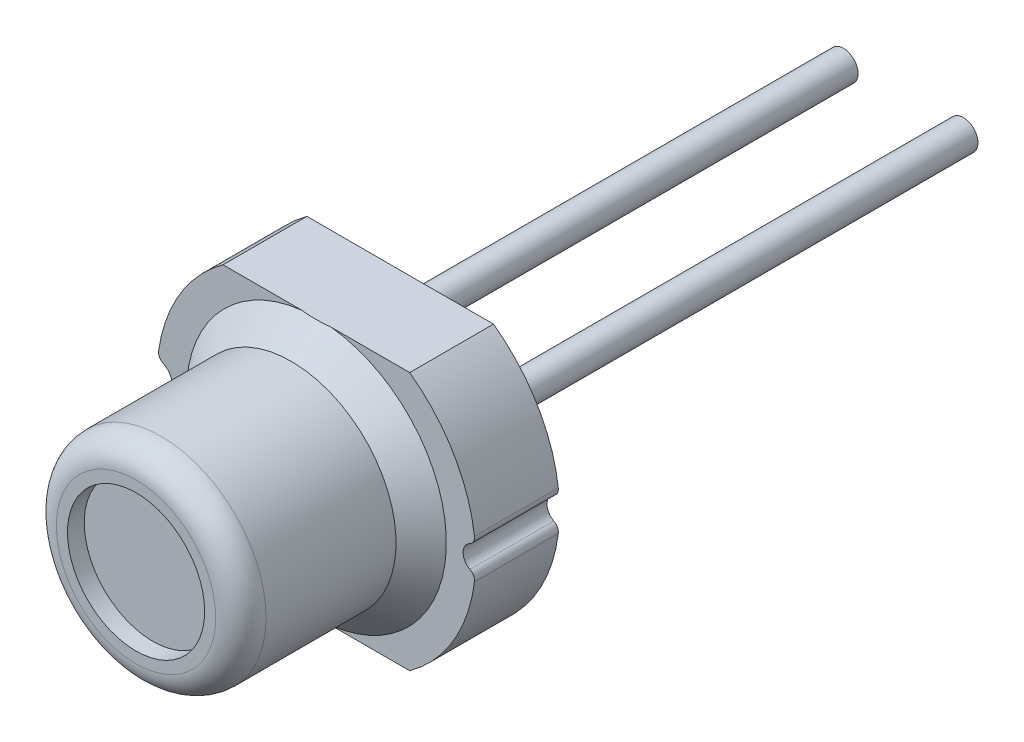
ISO-10303-21;
HEADER;
FILE_DESCRIPTION(('STEP AP214'),'2;1');
FILE_NAME('part.step','',(''),(''),'','','');
FILE_SCHEMA(('AUTOMOTIVE_DESIGN { 1 0 10303 214 1 1 1 1 }'));
ENDSEC;
DATA;
#1=APPLICATION_CONTEXT('core data for automotive mechanical design processes');
#2=APPLICATION_PROTOCOL_DEFINITION('international standard','automotive_design',2000,#1);
#3=PRODUCT_CONTEXT('',#1,'mechanical');
#4=PRODUCT('Part','Part','',(#3));
#5=PRODUCT_RELATED_PRODUCT_CATEGORY('part','',(#4));
#6=PRODUCT_DEFINITION_FORMATION('','',#4);
#7=PRODUCT_DEFINITION_CONTEXT('part definition',#1,'design');
#8=PRODUCT_DEFINITION('design','',#6,#7);
#9=PRODUCT_DEFINITION_SHAPE('','',#8);
#10=(LENGTH_UNIT() NAMED_UNIT(*) SI_UNIT(.MILLI.,.METRE.));
#11=(NAMED_UNIT(*) PLANE_ANGLE_UNIT() SI_UNIT($,.RADIAN.));
#12=(NAMED_UNIT(*) SI_UNIT($,.STERADIAN.) SOLID_ANGLE_UNIT());
#13=UNCERTAINTY_MEASURE_WITH_UNIT(LENGTH_MEASURE(1.E-05),#10,'distance_accuracy_value','');
#14=(GEOMETRIC_REPRESENTATION_CONTEXT(3) GLOBAL_UNCERTAINTY_ASSIGNED_CONTEXT((#13)) GLOBAL_UNIT_ASSIGNED_CONTEXT((#10,
#11,#12)) REPRESENTATION_CONTEXT('',''));
#15=CARTESIAN_POINT('',(0.,0.,0.));
#16=DIRECTION('',(0.,0.,1.));
#17=DIRECTION('',(1.,0.,0.));
#18=AXIS2_PLACEMENT_3D('',#15,#16,#17);
#19=CARTESIAN_POINT('',(0.,0.,1.));
#20=DIRECTION('',(0.,0.,1.));
#21=DIRECTION('',(1.,0.,0.));
#22=AXIS2_PLACEMENT_3D('',#19,#20,#21);
#23=PLANE('',#22);
#24=DIRECTION('',(-1.,0.,0.));
#25=VECTOR('',#24,1.);
#26=CARTESIAN_POINT('',(-1.11283421945948,1.54,1.));
#27=LINE('',#26,#25);
#28=CARTESIAN_POINT('',(1.11283421945948,1.54,1.));
#29=VERTEX_POINT('',#28);
#30=CARTESIAN_POINT('',(0.175783958312475,1.54,1.));
#31=VERTEX_POINT('',#30);
#32=EDGE_CURVE('E314',#29,#31,#27,.T.);
#33=ORIENTED_EDGE('',*,*,#32,.T.);
#34=CARTESIAN_POINT('',(0.,0.,1.));
#35=DIRECTION('',(0.,0.,1.));
#36=DIRECTION('',(1.,0.,0.));
#37=AXIS2_PLACEMENT_3D('',#34,#35,#36);
#38=CIRCLE('',#37,1.55);
#39=CARTESIAN_POINT('',(0.175783958312475,-1.54,1.));
#40=VERTEX_POINT('',#39);
#41=EDGE_CURVE('E183',#31,#40,#38,.F.);
#42=ORIENTED_EDGE('',*,*,#41,.T.);
#43=DIRECTION('',(1.,0.,0.));
#44=VECTOR('',#43,1.);
#45=CARTESIAN_POINT('',(-1.11283421945948,-1.54,1.));
#46=LINE('',#45,#44);
#47=CARTESIAN_POINT('',(1.11283421945948,-1.54,1.));
#48=VERTEX_POINT('',#47);
#49=EDGE_CURVE('E365',#40,#48,#46,.T.);
#50=ORIENTED_EDGE('',*,*,#49,.T.);
#51=CARTESIAN_POINT('',(0.,0.,1.));
#52=DIRECTION('',(0.,0.,1.));
#53=DIRECTION('',(1.,0.,0.));
#54=AXIS2_PLACEMENT_3D('',#51,#52,#53);
#55=CIRCLE('',#54,1.9);
#56=CARTESIAN_POINT('',(1.88541666666667,-0.23495530012229,1.));
#57=VERTEX_POINT('',#56);
#58=EDGE_CURVE('E374',#48,#57,#55,.T.);
#59=ORIENTED_EDGE('',*,*,#58,.T.);
#60=CARTESIAN_POINT('',(1.78618421052632,-0.222589231694801,1.));
#61=DIRECTION('',(0.,0.,1.));
#62=DIRECTION('',(-1.,0.,0.));
#63=AXIS2_PLACEMENT_3D('',#60,#61,#62);
#64=CIRCLE('',#63,0.1);
#65=CARTESIAN_POINT('',(1.83171052631579,-0.133553539016881,1.));
#66=VERTEX_POINT('',#65);
#67=EDGE_CURVE('E289',#57,#66,#64,.T.);
#68=ORIENTED_EDGE('',*,*,#67,.T.);
#69=CARTESIAN_POINT('',(1.9,0.,1.));
#70=DIRECTION('',(0.,0.,-1.));
#71=DIRECTION('',(1.,0.,0.));
#72=AXIS2_PLACEMENT_3D('',#69,#70,#71);
#73=CIRCLE('',#72,0.15);
#74=CARTESIAN_POINT('',(1.83171052631579,0.133553539016881,1.));
#75=VERTEX_POINT('',#74);
#76=EDGE_CURVE('E379',#66,#75,#73,.T.);
#77=ORIENTED_EDGE('',*,*,#76,.T.);
#78=CARTESIAN_POINT('',(1.78618421052632,0.222589231694801,1.));
#79=DIRECTION('',(0.,0.,1.));
#80=DIRECTION('',(1.,0.,0.));
#81=AXIS2_PLACEMENT_3D('',#78,#79,#80);
#82=CIRCLE('',#81,0.1);
#83=CARTESIAN_POINT('',(1.88541666666667,0.23495530012229,1.));
#84=VERTEX_POINT('',#83);
#85=EDGE_CURVE('E382',#75,#84,#82,.T.);
#86=ORIENTED_EDGE('',*,*,#85,.T.);
#87=CARTESIAN_POINT('',(0.,0.,1.));
#88=DIRECTION('',(0.,0.,1.));
#89=DIRECTION('',(1.,0.,0.));
#90=AXIS2_PLACEMENT_3D('',#87,#88,#89);
#91=CIRCLE('',#90,1.9);
#92=EDGE_CURVE('E385',#84,#29,#91,.T.);
#93=ORIENTED_EDGE('',*,*,#92,.T.);
#94=EDGE_LOOP('',(#33,#42,#50,#59,#68,#77,#86,#93));
#95=FACE_BOUND('',#94,.T.);
#96=ADVANCED_FACE('F41',(#95),#23,.T.);
#97=CARTESIAN_POINT('',(0.,0.,1.));
#98=DIRECTION('',(0.,0.,-1.));
#99=DIRECTION('',(-1.,0.,0.));
#100=AXIS2_PLACEMENT_3D('',#97,#98,#99);
#101=CYLINDRICAL_SURFACE('',#100,1.9);
#102=CARTESIAN_POINT('',(0.,0.,0.));
#103=DIRECTION('',(0.,0.,1.));
#104=DIRECTION('',(1.,0.,0.));
#105=AXIS2_PLACEMENT_3D('',#102,#103,#104);
#106=CIRCLE('',#105,1.9);
#107=CARTESIAN_POINT('',(-1.11283421945948,1.54,0.));
#108=VERTEX_POINT('',#107);
#109=CARTESIAN_POINT('',(-1.881,0.268027983613654,0.));
#110=VERTEX_POINT('',#109);
#111=EDGE_CURVE('E169',#108,#110,#106,.T.);
#112=ORIENTED_EDGE('',*,*,#111,.T.);
#113=DIRECTION('',(0.,0.,-1.));
#114=VECTOR('',#113,1.);
#115=CARTESIAN_POINT('',(-1.881,0.268027983613654,1.));
#116=LINE('',#115,#114);
#117=CARTESIAN_POINT('',(-1.881,0.268027983613654,1.));
#118=VERTEX_POINT('',#117);
#119=EDGE_CURVE('E149',#118,#110,#116,.T.);
#120=ORIENTED_EDGE('',*,*,#119,.F.);
#121=CARTESIAN_POINT('',(0.,0.,1.));
#122=DIRECTION('',(0.,0.,1.));
#123=DIRECTION('',(1.,0.,0.));
#124=AXIS2_PLACEMENT_3D('',#121,#122,#123);
#125=CIRCLE('',#124,1.9);
#126=CARTESIAN_POINT('',(-1.11283421945948,1.54,1.));
#127=VERTEX_POINT('',#126);
#128=EDGE_CURVE('E156',#127,#118,#125,.T.);
#129=ORIENTED_EDGE('',*,*,#128,.F.);
#130=DIRECTION('',(0.,0.,-1.));
#131=VECTOR('',#130,1.);
#132=CARTESIAN_POINT('',(-1.11283421945948,1.54,1.));
#133=LINE('',#132,#131);
#134=EDGE_CURVE('E310',#127,#108,#133,.T.);
#135=ORIENTED_EDGE('',*,*,#134,.T.);
#136=EDGE_LOOP('',(#112,#120,#129,#135));
#137=FACE_BOUND('',#136,.T.);
#138=ADVANCED_FACE('F167',(#137),#101,.T.);
#139=CARTESIAN_POINT('',(-1.782,0.253921247633988,1.));
#140=DIRECTION('',(0.,0.,-1.));
#141=DIRECTION('',(-1.,0.,0.));
#142=AXIS2_PLACEMENT_3D('',#139,#140,#141);
#143=CYLINDRICAL_SURFACE('',#142,0.1);
#144=CARTESIAN_POINT('',(-1.782,0.253921247633988,0.));
#145=DIRECTION('',(0.,0.,1.));
#146=DIRECTION('',(-1.,0.,0.));
#147=AXIS2_PLACEMENT_3D('',#144,#145,#146);
#148=CIRCLE('',#147,0.1);
#149=CARTESIAN_POINT('',(-1.82414285714286,0.163235087764707,0.));
#150=VERTEX_POINT('',#149);
#151=EDGE_CURVE('E354',#110,#150,#148,.T.);
#152=ORIENTED_EDGE('',*,*,#151,.T.);
#153=DIRECTION('',(0.,0.,-1.));
#154=VECTOR('',#153,1.);
#155=CARTESIAN_POINT('',(-1.82414285714286,0.163235087764707,1.));
#156=LINE('',#155,#154);
#157=CARTESIAN_POINT('',(-1.82414285714286,0.163235087764707,1.));
#158=VERTEX_POINT('',#157);
#159=EDGE_CURVE('E152',#158,#150,#156,.T.);
#160=ORIENTED_EDGE('',*,*,#159,.F.);
#161=CARTESIAN_POINT('',(-1.782,0.253921247633988,1.));
#162=DIRECTION('',(0.,0.,1.));
#163=DIRECTION('',(-1.,0.,0.));
#164=AXIS2_PLACEMENT_3D('',#161,#162,#163);
#165=CIRCLE('',#164,0.1);
#166=EDGE_CURVE('E145',#118,#158,#165,.T.);
#167=ORIENTED_EDGE('',*,*,#166,.F.);
#168=ORIENTED_EDGE('',*,*,#119,.T.);
#169=EDGE_LOOP('',(#152,#160,#167,#168));
#170=FACE_BOUND('',#169,.T.);
#171=ADVANCED_FACE('F147',(#170),#143,.T.);
#172=CARTESIAN_POINT('',(-1.9,0.,1.));
#173=DIRECTION('',(0.,0.,-1.));
#174=DIRECTION('',(-1.,0.,0.));
#175=AXIS2_PLACEMENT_3D('',#172,#173,#174);
#176=CYLINDRICAL_SURFACE('',#175,0.180000000000002);
#177=CARTESIAN_POINT('',(-1.9,0.,0.));
#178=DIRECTION('',(0.,0.,-1.));
#179=DIRECTION('',(1.,0.,0.));
#180=AXIS2_PLACEMENT_3D('',#177,#178,#179);
#181=CIRCLE('',#180,0.180000000000002);
#182=CARTESIAN_POINT('',(-1.82414285714286,-0.163235087764707,0.));
#183=VERTEX_POINT('',#182);
#184=EDGE_CURVE('E347',#150,#183,#181,.T.);
#185=ORIENTED_EDGE('',*,*,#184,.T.);
#186=DIRECTION('',(0.,0.,-1.));
#187=VECTOR('',#186,1.);
#188=CARTESIAN_POINT('',(-1.82414285714286,-0.163235087764707,1.));
#189=LINE('',#188,#187);
#190=CARTESIAN_POINT('',(-1.82414285714286,-0.163235087764707,1.));
#191=VERTEX_POINT('',#190);
#192=EDGE_CURVE('E177',#191,#183,#189,.T.);
#193=ORIENTED_EDGE('',*,*,#192,.F.);
#194=CARTESIAN_POINT('',(-1.9,0.,1.));
#195=DIRECTION('',(0.,0.,-1.));
#196=DIRECTION('',(1.,0.,0.));
#197=AXIS2_PLACEMENT_3D('',#194,#195,#196);
#198=CIRCLE('',#197,0.180000000000002);
#199=EDGE_CURVE('E155',#158,#191,#198,.T.);
#200=ORIENTED_EDGE('',*,*,#199,.F.);
#201=ORIENTED_EDGE('',*,*,#159,.T.);
#202=EDGE_LOOP('',(#185,#193,#200,#201));
#203=FACE_BOUND('',#202,.T.);
#204=ADVANCED_FACE('F216',(#203),#176,.F.);
#205=CARTESIAN_POINT('',(-1.782,-0.253921247633987,1.));
#206=DIRECTION('',(0.,0.,-1.));
#207=DIRECTION('',(-1.,0.,0.));
#208=AXIS2_PLACEMENT_3D('',#205,#206,#207);
#209=CYLINDRICAL_SURFACE('',#208,0.1);
#210=CARTESIAN_POINT('',(-1.782,-0.253921247633987,0.));
#211=DIRECTION('',(0.,0.,1.));
#212=DIRECTION('',(1.,0.,0.));
#213=AXIS2_PLACEMENT_3D('',#210,#211,#212);
#214=CIRCLE('',#213,0.1);
#215=CARTESIAN_POINT('',(-1.881,-0.268027983613653,0.));
#216=VERTEX_POINT('',#215);
#217=EDGE_CURVE('E343',#183,#216,#214,.T.);
#218=ORIENTED_EDGE('',*,*,#217,.T.);
#219=DIRECTION('',(0.,0.,-1.));
#220=VECTOR('',#219,1.);
#221=CARTESIAN_POINT('',(-1.881,-0.268027983613653,1.));
#222=LINE('',#221,#220);
#223=CARTESIAN_POINT('',(-1.881,-0.268027983613653,1.));
#224=VERTEX_POINT('',#223);
#225=EDGE_CURVE('E334',#224,#216,#222,.T.);
#226=ORIENTED_EDGE('',*,*,#225,.F.);
#227=CARTESIAN_POINT('',(-1.782,-0.253921247633987,1.));
#228=DIRECTION('',(0.,0.,1.));
#229=DIRECTION('',(1.,0.,0.));
#230=AXIS2_PLACEMENT_3D('',#227,#228,#229);
#231=CIRCLE('',#230,0.1);
#232=EDGE_CURVE('E344',#191,#224,#231,.T.);
#233=ORIENTED_EDGE('',*,*,#232,.F.);
#234=ORIENTED_EDGE('',*,*,#192,.T.);
#235=EDGE_LOOP('',(#218,#226,#233,#234));
#236=FACE_BOUND('',#235,.T.);
#237=ADVANCED_FACE('F219',(#236),#209,.T.);
#238=CARTESIAN_POINT('',(0.,0.,1.));
#239=DIRECTION('',(0.,0.,-1.));
#240=DIRECTION('',(-1.,0.,0.));
#241=AXIS2_PLACEMENT_3D('',#238,#239,#240);
#242=CYLINDRICAL_SURFACE('',#241,1.9);
#243=CARTESIAN_POINT('',(0.,0.,0.));
#244=DIRECTION('',(0.,0.,1.));
#245=DIRECTION('',(1.,0.,0.));
#246=AXIS2_PLACEMENT_3D('',#243,#244,#245);
#247=CIRCLE('',#246,1.9);
#248=CARTESIAN_POINT('',(-1.11283421945948,-1.54,0.));
#249=VERTEX_POINT('',#248);
#250=EDGE_CURVE('E348',#216,#249,#247,.T.);
#251=ORIENTED_EDGE('',*,*,#250,.T.);
#252=DIRECTION('',(0.,0.,-1.));
#253=VECTOR('',#252,1.);
#254=CARTESIAN_POINT('',(-1.11283421945948,-1.54,1.));
#255=LINE('',#254,#253);
#256=CARTESIAN_POINT('',(-1.11283421945948,-1.54,1.));
#257=VERTEX_POINT('',#256);
#258=EDGE_CURVE('E330',#257,#249,#255,.T.);
#259=ORIENTED_EDGE('',*,*,#258,.F.);
#260=CARTESIAN_POINT('',(0.,0.,1.));
#261=DIRECTION('',(0.,0.,1.));
#262=DIRECTION('',(1.,0.,0.));
#263=AXIS2_PLACEMENT_3D('',#260,#261,#262);
#264=CIRCLE('',#263,1.9);
#265=EDGE_CURVE('E363',#224,#257,#264,.T.);
#266=ORIENTED_EDGE('',*,*,#265,.F.);
#267=ORIENTED_EDGE('',*,*,#225,.T.);
#268=EDGE_LOOP('',(#251,#259,#266,#267));
#269=FACE_BOUND('',#268,.T.);
#270=ADVANCED_FACE('F222',(#269),#242,.T.);
#271=CARTESIAN_POINT('',(-1.11283421945948,-1.54,1.));
#272=DIRECTION('',(0.,1.,0.));
#273=DIRECTION('',(0.,0.,1.));
#274=AXIS2_PLACEMENT_3D('',#271,#272,#273);
#275=PLANE('',#274);
#276=DIRECTION('',(1.,0.,0.));
#277=VECTOR('',#276,1.);
#278=CARTESIAN_POINT('',(-1.11283421945948,-1.54,0.));
#279=LINE('',#278,#277);
#280=CARTESIAN_POINT('',(1.11283421945948,-1.54,0.));
#281=VERTEX_POINT('',#280);
#282=EDGE_CURVE('E285',#249,#281,#279,.T.);
#283=ORIENTED_EDGE('',*,*,#282,.T.);
#284=DIRECTION('',(0.,0.,-1.));
#285=VECTOR('',#284,1.);
#286=CARTESIAN_POINT('',(1.11283421945948,-1.54,1.));
#287=LINE('',#286,#285);
#288=EDGE_CURVE('E279',#48,#281,#287,.T.);
#289=ORIENTED_EDGE('',*,*,#288,.F.);
#290=ORIENTED_EDGE('',*,*,#49,.F.);
#291=CARTESIAN_POINT('',(0.175783958312475,-1.54,1.));
#292=CARTESIAN_POINT('',(0.11718930554165,-1.54,1.00666666666667));
#293=CARTESIAN_POINT('',(0.0585946527708252,-1.54,1.01));
#294=CARTESIAN_POINT('',(-0.0585946527708252,-1.54,1.01));
#295=CARTESIAN_POINT('',(-0.11718930554165,-1.54,1.00666666666667));
#296=CARTESIAN_POINT('',(-0.175783958312475,-1.54,1.));
#297=B_SPLINE_CURVE_WITH_KNOTS('',3,(#291,#292,#293,#294,#295,#296),.UNSPECIFIED.,.F.,.F.,(4,2,
4),(0.,0.176068168616596,0.352136337233192),.UNSPECIFIED.);
#298=CARTESIAN_POINT('',(-0.175783958312475,-1.54,1.));
#299=VERTEX_POINT('',#298);
#300=EDGE_CURVE('E187',#40,#299,#297,.T.);
#301=ORIENTED_EDGE('',*,*,#300,.T.);
#302=EDGE_CURVE('E361',#257,#299,#46,.T.);
#303=ORIENTED_EDGE('',*,*,#302,.F.);
#304=ORIENTED_EDGE('',*,*,#258,.T.);
#305=EDGE_LOOP('',(#283,#289,#290,#301,#303,#304));
#306=FACE_BOUND('',#305,.T.);
#307=ADVANCED_FACE('F201',(#306),#275,.F.);
#308=CARTESIAN_POINT('',(0.,0.,1.));
#309=DIRECTION('',(0.,0.,-1.));
#310=DIRECTION('',(-1.,0.,0.));
#311=AXIS2_PLACEMENT_3D('',#308,#309,#310);
#312=CYLINDRICAL_SURFACE('',#311,1.9);
#313=CARTESIAN_POINT('',(0.,0.,0.));
#314=DIRECTION('',(0.,0.,1.));
#315=DIRECTION('',(1.,0.,0.));
#316=AXIS2_PLACEMENT_3D('',#313,#314,#315);
#317=CIRCLE('',#316,1.9);
#318=CARTESIAN_POINT('',(1.88541666666667,-0.23495530012229,0.));
#319=VERTEX_POINT('',#318);
#320=EDGE_CURVE('E273',#281,#319,#317,.T.);
#321=ORIENTED_EDGE('',*,*,#320,.T.);
#322=DIRECTION('',(0.,0.,-1.));
#323=VECTOR('',#322,1.);
#324=CARTESIAN_POINT('',(1.88541666666667,-0.23495530012229,1.));
#325=LINE('',#324,#323);
#326=EDGE_CURVE('E276',#57,#319,#325,.T.);
#327=ORIENTED_EDGE('',*,*,#326,.F.);
#328=ORIENTED_EDGE('',*,*,#58,.F.);
#329=ORIENTED_EDGE('',*,*,#288,.T.);
#330=EDGE_LOOP('',(#321,#327,#328,#329));
#331=FACE_BOUND('',#330,.T.);
#332=ADVANCED_FACE('F229',(#331),#312,.T.);
#333=CARTESIAN_POINT('',(1.78618421052632,-0.222589231694801,1.));
#334=DIRECTION('',(0.,0.,-1.));
#335=DIRECTION('',(-1.,0.,0.));
#336=AXIS2_PLACEMENT_3D('',#333,#334,#335);
#337=CYLINDRICAL_SURFACE('',#336,0.1);
#338=CARTESIAN_POINT('',(1.78618421052632,-0.222589231694801,0.));
#339=DIRECTION('',(0.,0.,1.));
#340=DIRECTION('',(-1.,0.,0.));
#341=AXIS2_PLACEMENT_3D('',#338,#339,#340);
#342=CIRCLE('',#341,0.1);
#343=CARTESIAN_POINT('',(1.83171052631579,-0.133553539016881,0.));
#344=VERTEX_POINT('',#343);
#345=EDGE_CURVE('E284',#319,#344,#342,.T.);
#346=ORIENTED_EDGE('',*,*,#345,.T.);
#347=DIRECTION('',(0.,0.,-1.));
#348=VECTOR('',#347,1.);
#349=CARTESIAN_POINT('',(1.83171052631579,-0.133553539016881,1.));
#350=LINE('',#349,#348);
#351=EDGE_CURVE('E291',#66,#344,#350,.T.);
#352=ORIENTED_EDGE('',*,*,#351,.F.);
#353=ORIENTED_EDGE('',*,*,#67,.F.);
#354=ORIENTED_EDGE('',*,*,#326,.T.);
#355=EDGE_LOOP('',(#346,#352,#353,#354));
#356=FACE_BOUND('',#355,.T.);
#357=ADVANCED_FACE('F262',(#356),#337,.T.);
#358=CARTESIAN_POINT('',(1.9,0.,1.));
#359=DIRECTION('',(0.,0.,-1.));
#360=DIRECTION('',(-1.,0.,0.));
#361=AXIS2_PLACEMENT_3D('',#358,#359,#360);
#362=CYLINDRICAL_SURFACE('',#361,0.15);
#363=CARTESIAN_POINT('',(1.9,0.,0.));
#364=DIRECTION('',(0.,0.,-1.));
#365=DIRECTION('',(1.,0.,0.));
#366=AXIS2_PLACEMENT_3D('',#363,#364,#365);
#367=CIRCLE('',#366,0.15);
#368=CARTESIAN_POINT('',(1.83171052631579,0.133553539016881,0.));
#369=VERTEX_POINT('',#368);
#370=EDGE_CURVE('E295',#344,#369,#367,.T.);
#371=ORIENTED_EDGE('',*,*,#370,.T.);
#372=DIRECTION('',(0.,0.,-1.));
#373=VECTOR('',#372,1.);
#374=CARTESIAN_POINT('',(1.83171052631579,0.133553539016881,1.));
#375=LINE('',#374,#373);
#376=EDGE_CURVE('E322',#75,#369,#375,.T.);
#377=ORIENTED_EDGE('',*,*,#376,.F.);
#378=ORIENTED_EDGE('',*,*,#76,.F.);
#379=ORIENTED_EDGE('',*,*,#351,.T.);
#380=EDGE_LOOP('',(#371,#377,#378,#379));
#381=FACE_BOUND('',#380,.T.);
#382=ADVANCED_FACE('F258',(#381),#362,.F.);
#383=CARTESIAN_POINT('',(1.78618421052632,0.222589231694801,1.));
#384=DIRECTION('',(0.,0.,-1.));
#385=DIRECTION('',(-1.,0.,0.));
#386=AXIS2_PLACEMENT_3D('',#383,#384,#385);
#387=CYLINDRICAL_SURFACE('',#386,0.1);
#388=CARTESIAN_POINT('',(1.78618421052632,0.222589231694801,0.));
#389=DIRECTION('',(0.,0.,1.));
#390=DIRECTION('',(1.,0.,0.));
#391=AXIS2_PLACEMENT_3D('',#388,#389,#390);
#392=CIRCLE('',#391,0.1);
#393=CARTESIAN_POINT('',(1.88541666666667,0.23495530012229,0.));
#394=VERTEX_POINT('',#393);
#395=EDGE_CURVE('E299',#369,#394,#392,.T.);
#396=ORIENTED_EDGE('',*,*,#395,.T.);
#397=DIRECTION('',(0.,0.,-1.));
#398=VECTOR('',#397,1.);
#399=CARTESIAN_POINT('',(1.88541666666667,0.23495530012229,1.));
#400=LINE('',#399,#398);
#401=EDGE_CURVE('E318',#84,#394,#400,.T.);
#402=ORIENTED_EDGE('',*,*,#401,.F.);
#403=ORIENTED_EDGE('',*,*,#85,.F.);
#404=ORIENTED_EDGE('',*,*,#376,.T.);
#405=EDGE_LOOP('',(#396,#402,#403,#404));
#406=FACE_BOUND('',#405,.T.);
#407=ADVANCED_FACE('F251',(#406),#387,.T.);
#408=CARTESIAN_POINT('',(0.,0.,1.));
#409=DIRECTION('',(0.,0.,-1.));
#410=DIRECTION('',(-1.,0.,0.));
#411=AXIS2_PLACEMENT_3D('',#408,#409,#410);
#412=CYLINDRICAL_SURFACE('',#411,1.9);
#413=CARTESIAN_POINT('',(0.,0.,0.));
#414=DIRECTION('',(0.,0.,1.));
#415=DIRECTION('',(1.,0.,0.));
#416=AXIS2_PLACEMENT_3D('',#413,#414,#415);
#417=CIRCLE('',#416,1.9);
#418=CARTESIAN_POINT('',(1.11283421945948,1.54,0.));
#419=VERTEX_POINT('',#418);
#420=EDGE_CURVE('E305',#394,#419,#417,.T.);
#421=ORIENTED_EDGE('',*,*,#420,.T.);
#422=DIRECTION('',(0.,0.,-1.));
#423=VECTOR('',#422,1.);
#424=CARTESIAN_POINT('',(1.11283421945948,1.54,1.));
#425=LINE('',#424,#423);
#426=EDGE_CURVE('E313',#29,#419,#425,.T.);
#427=ORIENTED_EDGE('',*,*,#426,.F.);
#428=ORIENTED_EDGE('',*,*,#92,.F.);
#429=ORIENTED_EDGE('',*,*,#401,.T.);
#430=EDGE_LOOP('',(#421,#427,#428,#429));
#431=FACE_BOUND('',#430,.T.);
#432=ADVANCED_FACE('F247',(#431),#412,.T.);
#433=CARTESIAN_POINT('',(-1.11283421945948,1.54,1.));
#434=DIRECTION('',(0.,-1.,0.));
#435=DIRECTION('',(0.,0.,-1.));
#436=AXIS2_PLACEMENT_3D('',#433,#434,#435);
#437=PLANE('',#436);
#438=DIRECTION('',(-1.,0.,0.));
#439=VECTOR('',#438,1.);
#440=CARTESIAN_POINT('',(-1.11283421945948,1.54,0.));
#441=LINE('',#440,#439);
#442=EDGE_CURVE('E165',#419,#108,#441,.T.);
#443=ORIENTED_EDGE('',*,*,#442,.T.);
#444=ORIENTED_EDGE('',*,*,#134,.F.);
#445=CARTESIAN_POINT('',(-0.175783958312475,1.54,1.));
#446=VERTEX_POINT('',#445);
#447=EDGE_CURVE('E160',#446,#127,#27,.T.);
#448=ORIENTED_EDGE('',*,*,#447,.F.);
#449=CARTESIAN_POINT('',(-0.175783958312475,1.54,1.));
#450=CARTESIAN_POINT('',(-0.11718930554165,1.54,1.00666666666667));
#451=CARTESIAN_POINT('',(-0.0585946527708252,1.54,1.01));
#452=CARTESIAN_POINT('',(0.0585946527708252,1.54,1.01));
#453=CARTESIAN_POINT('',(0.11718930554165,1.54,1.00666666666667));
#454=CARTESIAN_POINT('',(0.175783958312475,1.54,1.));
#455=B_SPLINE_CURVE_WITH_KNOTS('',3,(#449,#450,#451,#452,#453,#454),.UNSPECIFIED.,.F.,.F.,(4,2,
4),(0.,0.176068168616596,0.352136337233192),.UNSPECIFIED.);
#456=EDGE_CURVE('E64',#446,#31,#455,.T.);
#457=ORIENTED_EDGE('',*,*,#456,.T.);
#458=ORIENTED_EDGE('',*,*,#32,.F.);
#459=ORIENTED_EDGE('',*,*,#426,.T.);
#460=EDGE_LOOP('',(#443,#444,#448,#457,#458,#459));
#461=FACE_BOUND('',#460,.T.);
#462=ADVANCED_FACE('F240',(#461),#437,.F.);
#463=ORIENTED_EDGE('',*,*,#302,.T.);
#464=CARTESIAN_POINT('',(0.,0.,1.));
#465=DIRECTION('',(0.,0.,1.));
#466=DIRECTION('',(1.,0.,0.));
#467=AXIS2_PLACEMENT_3D('',#464,#465,#466);
#468=CIRCLE('',#467,1.55);
#469=EDGE_CURVE('E57',#299,#446,#468,.F.);
#470=ORIENTED_EDGE('',*,*,#469,.T.);
#471=ORIENTED_EDGE('',*,*,#447,.T.);
#472=ORIENTED_EDGE('',*,*,#128,.T.);
#473=ORIENTED_EDGE('',*,*,#166,.T.);
#474=ORIENTED_EDGE('',*,*,#199,.T.);
#475=ORIENTED_EDGE('',*,*,#232,.T.);
#476=ORIENTED_EDGE('',*,*,#265,.T.);
#477=EDGE_LOOP('',(#463,#470,#471,#472,#473,#474,#475,#476));
#478=FACE_BOUND('',#477,.T.);
#479=ADVANCED_FACE('F159',(#478),#23,.T.);
#480=CARTESIAN_POINT('',(0.,0.,0.));
#481=DIRECTION('',(0.,0.,1.));
#482=DIRECTION('',(1.,0.,0.));
#483=AXIS2_PLACEMENT_3D('',#480,#481,#482);
#484=PLANE('',#483);
#485=CARTESIAN_POINT('',(0.,-0.415,0.));
#486=DIRECTION('',(0.,0.,1.));
#487=DIRECTION('',(1.,0.,0.));
#488=AXIS2_PLACEMENT_3D('',#485,#486,#487);
#489=CIRCLE('',#488,0.340201153538614);
#490=CARTESIAN_POINT('',(0.340201153538614,-0.415,0.));
#491=VERTEX_POINT('',#490);
#492=EDGE_CURVE('E11',#491,#491,#489,.F.);
#493=ORIENTED_EDGE('',*,*,#492,.F.);
#494=EDGE_LOOP('',(#493));
#495=FACE_BOUND('',#494,.T.);
#496=CARTESIAN_POINT('',(-0.715,0.3,0.));
#497=DIRECTION('',(0.,0.,1.));
#498=DIRECTION('',(1.,0.,0.));
#499=AXIS2_PLACEMENT_3D('',#496,#497,#498);
#500=CIRCLE('',#499,0.175);
#501=CARTESIAN_POINT('',(-0.54,0.3,0.));
#502=VERTEX_POINT('',#501);
#503=EDGE_CURVE('E411',#502,#502,#500,.T.);
#504=ORIENTED_EDGE('',*,*,#503,.T.);
#505=EDGE_LOOP('',(#504));
#506=FACE_BOUND('',#505,.T.);
#507=CARTESIAN_POINT('',(0.715,0.3,0.));
#508=DIRECTION('',(0.,0.,1.));
#509=DIRECTION('',(1.,0.,0.));
#510=AXIS2_PLACEMENT_3D('',#507,#508,#509);
#511=CIRCLE('',#510,0.175);
#512=CARTESIAN_POINT('',(0.89,0.3,0.));
#513=VERTEX_POINT('',#512);
#514=EDGE_CURVE('E403',#513,#513,#511,.T.);
#515=ORIENTED_EDGE('',*,*,#514,.T.);
#516=EDGE_LOOP('',(#515));
#517=FACE_BOUND('',#516,.T.);
#518=ORIENTED_EDGE('',*,*,#111,.F.);
#519=ORIENTED_EDGE('',*,*,#442,.F.);
#520=ORIENTED_EDGE('',*,*,#420,.F.);
#521=ORIENTED_EDGE('',*,*,#395,.F.);
#522=ORIENTED_EDGE('',*,*,#370,.F.);
#523=ORIENTED_EDGE('',*,*,#345,.F.);
#524=ORIENTED_EDGE('',*,*,#320,.F.);
#525=ORIENTED_EDGE('',*,*,#282,.F.);
#526=ORIENTED_EDGE('',*,*,#250,.F.);
#527=ORIENTED_EDGE('',*,*,#217,.F.);
#528=ORIENTED_EDGE('',*,*,#184,.F.);
#529=ORIENTED_EDGE('',*,*,#151,.F.);
#530=EDGE_LOOP('',(#518,#519,#520,#521,#522,#523,#524,#525,#526,#527,#528,#529));
#531=FACE_BOUND('',#530,.T.);
#532=ADVANCED_FACE('F239',(#495,#506,#517,#531),#484,.F.);
#533=CARTESIAN_POINT('',(0.,0.,3.15));
#534=DIRECTION('',(0.,0.,-1.));
#535=DIRECTION('',(-1.,0.,0.));
#536=AXIS2_PLACEMENT_3D('',#533,#534,#535);
#537=CYLINDRICAL_SURFACE('',#536,1.25);
#538=CARTESIAN_POINT('',(0.,0.,2.85));
#539=DIRECTION('',(0.,0.,1.));
#540=DIRECTION('',(1.,0.,0.));
#541=AXIS2_PLACEMENT_3D('',#538,#539,#540);
#542=CIRCLE('',#541,1.25);
#543=CARTESIAN_POINT('',(-1.25,0.,2.85));
#544=VERTEX_POINT('',#543);
#545=EDGE_CURVE('E470',#544,#544,#542,.F.);
#546=CARTESIAN_POINT('',(0.,0.,1.3));
#547=DIRECTION('',(0.,0.,1.));
#548=DIRECTION('',(1.,0.,0.));
#549=AXIS2_PLACEMENT_3D('',#546,#547,#548);
#550=CIRCLE('',#549,1.25);
#551=CARTESIAN_POINT('',(-1.25,0.,1.3));
#552=VERTEX_POINT('',#551);
#553=EDGE_CURVE('E171',#552,#552,#550,.T.);
#554=CARTESIAN_POINT('',(-1.25,0.,2.85));
#555=CARTESIAN_POINT('',(-1.25,0.,2.83385416666667));
#556=CARTESIAN_POINT('',(-1.25,0.,2.81770833333333));
#557=CARTESIAN_POINT('',(-1.25,0.,2.78541666666667));
#558=CARTESIAN_POINT('',(-1.25,0.,2.76927083333333));
#559=CARTESIAN_POINT('',(-1.25,0.,2.73697916666667));
#560=CARTESIAN_POINT('',(-1.25,0.,2.72083333333333));
#561=CARTESIAN_POINT('',(-1.25,0.,2.68854166666667));
#562=CARTESIAN_POINT('',(-1.25,0.,2.67239583333333));
#563=CARTESIAN_POINT('',(-1.25,0.,2.64010416666667));
#564=CARTESIAN_POINT('',(-1.25,0.,2.62395833333333));
#565=CARTESIAN_POINT('',(-1.25,0.,2.59166666666667));
#566=CARTESIAN_POINT('',(-1.25,0.,2.57552083333333));
#567=CARTESIAN_POINT('',(-1.25,0.,2.54322916666667));
#568=CARTESIAN_POINT('',(-1.25,0.,2.52708333333333));
#569=CARTESIAN_POINT('',(-1.25,0.,2.49479166666667));
#570=CARTESIAN_POINT('',(-1.25,0.,2.47864583333333));
#571=CARTESIAN_POINT('',(-1.25,0.,2.44635416666667));
#572=CARTESIAN_POINT('',(-1.25,0.,2.43020833333333));
#573=CARTESIAN_POINT('',(-1.25,0.,2.39791666666667));
#574=CARTESIAN_POINT('',(-1.25,0.,2.38177083333333));
#575=CARTESIAN_POINT('',(-1.25,0.,2.34947916666667));
#576=CARTESIAN_POINT('',(-1.25,0.,2.33333333333333));
#577=CARTESIAN_POINT('',(-1.25,0.,2.30104166666667));
#578=CARTESIAN_POINT('',(-1.25,0.,2.28489583333333));
#579=CARTESIAN_POINT('',(-1.25,0.,2.25260416666667));
#580=CARTESIAN_POINT('',(-1.25,0.,2.23645833333333));
#581=CARTESIAN_POINT('',(-1.25,0.,2.20416666666667));
#582=CARTESIAN_POINT('',(-1.25,0.,2.18802083333334));
#583=CARTESIAN_POINT('',(-1.25,0.,2.15572916666667));
#584=CARTESIAN_POINT('',(-1.25,0.,2.13958333333334));
#585=CARTESIAN_POINT('',(-1.25,0.,2.10729166666667));
#586=CARTESIAN_POINT('',(-1.25,0.,2.09114583333334));
#587=CARTESIAN_POINT('',(-1.25,0.,2.05885416666667));
#588=CARTESIAN_POINT('',(-1.25,0.,2.04270833333334));
#589=CARTESIAN_POINT('',(-1.25,0.,2.01041666666667));
#590=CARTESIAN_POINT('',(-1.25,0.,1.99427083333334));
#591=CARTESIAN_POINT('',(-1.25,0.,1.96197916666667));
#592=CARTESIAN_POINT('',(-1.25,0.,1.94583333333334));
#593=CARTESIAN_POINT('',(-1.25,0.,1.91354166666667));
#594=CARTESIAN_POINT('',(-1.25,0.,1.89739583333334));
#595=CARTESIAN_POINT('',(-1.25,0.,1.86510416666667));
#596=CARTESIAN_POINT('',(-1.25,0.,1.84895833333334));
#597=CARTESIAN_POINT('',(-1.25,0.,1.81666666666667));
#598=CARTESIAN_POINT('',(-1.25,0.,1.80052083333334));
#599=CARTESIAN_POINT('',(-1.25,0.,1.76822916666667));
#600=CARTESIAN_POINT('',(-1.25,0.,1.75208333333334));
#601=CARTESIAN_POINT('',(-1.25,0.,1.71979166666667));
#602=CARTESIAN_POINT('',(-1.25,0.,1.70364583333334));
#603=CARTESIAN_POINT('',(-1.25,0.,1.67135416666667));
#604=CARTESIAN_POINT('',(-1.25,0.,1.65520833333334));
#605=CARTESIAN_POINT('',(-1.25,0.,1.62291666666667));
#606=CARTESIAN_POINT('',(-1.25,0.,1.60677083333334));
#607=CARTESIAN_POINT('',(-1.25,0.,1.57447916666667));
#608=CARTESIAN_POINT('',(-1.25,0.,1.55833333333334));
#609=CARTESIAN_POINT('',(-1.25,0.,1.52604166666667));
#610=CARTESIAN_POINT('',(-1.25,0.,1.50989583333334));
#611=CARTESIAN_POINT('',(-1.25,0.,1.47760416666667));
#612=CARTESIAN_POINT('',(-1.25,0.,1.46145833333334));
#613=CARTESIAN_POINT('',(-1.25,0.,1.42916666666667));
#614=CARTESIAN_POINT('',(-1.25,0.,1.41302083333334));
#615=CARTESIAN_POINT('',(-1.25,0.,1.38072916666667));
#616=CARTESIAN_POINT('',(-1.25,0.,1.36458333333334));
#617=CARTESIAN_POINT('',(-1.25,0.,1.33229166666667));
#618=CARTESIAN_POINT('',(-1.25,0.,1.31614583333334));
#619=CARTESIAN_POINT('',(-1.25,0.,1.3));
#620=B_SPLINE_CURVE_WITH_KNOTS('',3,(#554,#555,#556,#557,#558,#559,#560,#561,#562,#563,#564,
#565,#566,#567,#568,#569,#570,#571,#572,#573,#574,#575,#576,#577,#578,#579,#580,#581,#582,#583,
#584,#585,#586,#587,#588,#589,#590,#591,#592,#593,#594,#595,#596,#597,#598,#599,#600,#601,#602,
#603,#604,#605,#606,#607,#608,#609,#610,#611,#612,#613,#614,#615,#616,#617,#618,#619),
.UNSPECIFIED.,.F.,.F.,(4,2,2,2,2,2,2,2,2,2,2,2,2,2,2,2,2,2,2,2,2,2,2,2,2,2,2,2,2,2,2,2,4),(0.,
0.0484374999999999,0.0968749999999997,0.1453125,0.193749999999999,0.242187499999999,
0.290624999999999,0.339062499999999,0.387499999999999,0.435937499999999,0.484374999999999,
0.532812499999999,0.581249999999998,0.629687499999998,0.678124999999998,0.726562499999998,
0.774999999999997,0.823437499999997,0.871874999999997,0.920312499999997,0.968749999999997,
1.0171875,1.065625,1.1140625,1.1625,1.2109375,1.259375,1.3078125,1.35625,1.4046875,1.453125,
1.5015625,1.55),.UNSPECIFIED.);
#621=EDGE_CURVE('BSEAM245',#544,#552,#620,.T.);
#622=ORIENTED_EDGE('',*,*,#545,.T.);
#623=ORIENTED_EDGE('',*,*,#553,.T.);
#624=ORIENTED_EDGE('',*,*,#621,.T.);
#625=ORIENTED_EDGE('',*,*,#621,.F.);
#626=EDGE_LOOP('',(#622,#624,#623,#625));
#627=FACE_BOUND('',#626,.T.);
#628=ADVANCED_FACE('F245',(#627),#537,.T.);
#629=CARTESIAN_POINT('',(0.,0.,3.15));
#630=DIRECTION('',(0.,0.,1.));
#631=DIRECTION('',(1.,0.,0.));
#632=AXIS2_PLACEMENT_3D('',#629,#630,#631);
#633=PLANE('',#632);
#634=CARTESIAN_POINT('',(0.,0.,3.15));
#635=DIRECTION('',(0.,0.,1.));
#636=DIRECTION('',(1.,0.,0.));
#637=AXIS2_PLACEMENT_3D('',#634,#635,#636);
#638=CIRCLE('',#637,0.817963917548305);
#639=CARTESIAN_POINT('',(0.817963917548305,0.,3.15));
#640=VERTEX_POINT('',#639);
#641=EDGE_CURVE('E395',#640,#640,#638,.T.);
#642=ORIENTED_EDGE('',*,*,#641,.F.);
#643=EDGE_LOOP('',(#642));
#644=FACE_BOUND('',#643,.T.);
#645=CARTESIAN_POINT('',(0.,0.,3.15));
#646=DIRECTION('',(0.,0.,1.));
#647=DIRECTION('',(1.,0.,0.));
#648=AXIS2_PLACEMENT_3D('',#645,#646,#647);
#649=CIRCLE('',#648,0.95);
#650=CARTESIAN_POINT('',(0.95,0.,3.15));
#651=VERTEX_POINT('',#650);
#652=EDGE_CURVE('E475',#651,#651,#649,.T.);
#653=ORIENTED_EDGE('',*,*,#652,.T.);
#654=EDGE_LOOP('',(#653));
#655=FACE_BOUND('',#654,.T.);
#656=ADVANCED_FACE('F209',(#644,#655),#633,.T.);
#657=CARTESIAN_POINT('',(0.,0.,1.3));
#658=DIRECTION('',(0.,0.,-1.));
#659=DIRECTION('',(-1.,0.,0.));
#660=AXIS2_PLACEMENT_3D('',#657,#658,#659);
#661=CONICAL_SURFACE('',#660,1.25,0.785398163397443);
#662=ORIENTED_EDGE('',*,*,#300,.F.);
#663=ORIENTED_EDGE('',*,*,#41,.F.);
#664=ORIENTED_EDGE('',*,*,#456,.F.);
#665=ORIENTED_EDGE('',*,*,#469,.F.);
#666=EDGE_LOOP('',(#662,#663,#664,#665));
#667=FACE_BOUND('',#666,.T.);
#668=ORIENTED_EDGE('',*,*,#553,.F.);
#669=EDGE_LOOP('',(#668));
#670=FACE_BOUND('',#669,.T.);
#671=ADVANCED_FACE('F205',(#667,#670),#661,.T.);
#672=CARTESIAN_POINT('',(0.,0.,2.85));
#673=DIRECTION('',(0.,0.,1.));
#674=DIRECTION('',(1.,0.,0.));
#675=AXIS2_PLACEMENT_3D('',#672,#673,#674);
#676=TOROIDAL_SURFACE('',#675,0.95,0.3);
#677=ORIENTED_EDGE('',*,*,#545,.F.);
#678=EDGE_LOOP('',(#677));
#679=FACE_BOUND('',#678,.T.);
#680=ORIENTED_EDGE('',*,*,#652,.F.);
#681=EDGE_LOOP('',(#680));
#682=FACE_BOUND('',#681,.T.);
#683=ADVANCED_FACE('F43',(#679,#682),#676,.T.);
#684=CARTESIAN_POINT('',(0.,0.,2.95));
#685=DIRECTION('',(0.,0.,1.));
#686=DIRECTION('',(1.,0.,0.));
#687=AXIS2_PLACEMENT_3D('',#684,#685,#686);
#688=CYLINDRICAL_SURFACE('',#687,0.817963917548305);
#689=CARTESIAN_POINT('',(0.,0.,2.95));
#690=DIRECTION('',(0.,0.,1.));
#691=DIRECTION('',(1.,0.,0.));
#692=AXIS2_PLACEMENT_3D('',#689,#690,#691);
#693=CIRCLE('',#692,0.817963917548305);
#694=CARTESIAN_POINT('',(0.817963917548305,0.,2.95));
#695=VERTEX_POINT('',#694);
#696=EDGE_CURVE('E391',#695,#695,#693,.T.);
#697=ORIENTED_EDGE('',*,*,#696,.F.);
#698=EDGE_LOOP('',(#697));
#699=FACE_BOUND('',#698,.T.);
#700=ORIENTED_EDGE('',*,*,#641,.T.);
#701=EDGE_LOOP('',(#700));
#702=FACE_BOUND('',#701,.T.);
#703=ADVANCED_FACE('F453',(#699,#702),#688,.F.);
#704=CARTESIAN_POINT('',(0.,0.,2.95));
#705=DIRECTION('',(0.,0.,1.));
#706=DIRECTION('',(1.,0.,0.));
#707=AXIS2_PLACEMENT_3D('',#704,#705,#706);
#708=PLANE('',#707);
#709=ORIENTED_EDGE('',*,*,#696,.T.);
#710=EDGE_LOOP('',(#709));
#711=FACE_BOUND('',#710,.T.);
#712=ADVANCED_FACE('F443',(#711),#708,.T.);
#713=CARTESIAN_POINT('',(0.715,0.3,-6.));
#714=DIRECTION('',(0.,0.,1.));
#715=DIRECTION('',(1.,0.,0.));
#716=AXIS2_PLACEMENT_3D('',#713,#714,#715);
#717=CYLINDRICAL_SURFACE('',#716,0.175);
#718=CARTESIAN_POINT('',(0.715,0.3,-6.));
#719=DIRECTION('',(0.,0.,1.));
#720=DIRECTION('',(1.,0.,0.));
#721=AXIS2_PLACEMENT_3D('',#718,#719,#720);
#722=CIRCLE('',#721,0.175);
#723=CARTESIAN_POINT('',(0.89,0.3,-6.));
#724=VERTEX_POINT('',#723);
#725=EDGE_CURVE('E399',#724,#724,#722,.T.);
#726=ORIENTED_EDGE('',*,*,#725,.T.);
#727=EDGE_LOOP('',(#726));
#728=FACE_BOUND('',#727,.T.);
#729=ORIENTED_EDGE('',*,*,#514,.F.);
#730=EDGE_LOOP('',(#729));
#731=FACE_BOUND('',#730,.T.);
#732=ADVANCED_FACE('F440',(#728,#731),#717,.T.);
#733=CARTESIAN_POINT('',(0.715,0.3,-6.));
#734=DIRECTION('',(0.,0.,1.));
#735=DIRECTION('',(1.,0.,0.));
#736=AXIS2_PLACEMENT_3D('',#733,#734,#735);
#737=PLANE('',#736);
#738=ORIENTED_EDGE('',*,*,#725,.F.);
#739=EDGE_LOOP('',(#738));
#740=FACE_BOUND('',#739,.T.);
#741=ADVANCED_FACE('F442',(#740),#737,.F.);
#742=CARTESIAN_POINT('',(-0.715,0.3,-6.));
#743=DIRECTION('',(0.,0.,1.));
#744=DIRECTION('',(1.,0.,0.));
#745=AXIS2_PLACEMENT_3D('',#742,#743,#744);
#746=CYLINDRICAL_SURFACE('',#745,0.175);
#747=CARTESIAN_POINT('',(-0.715,0.3,-6.));
#748=DIRECTION('',(0.,0.,1.));
#749=DIRECTION('',(1.,0.,0.));
#750=AXIS2_PLACEMENT_3D('',#747,#748,#749);
#751=CIRCLE('',#750,0.175);
#752=CARTESIAN_POINT('',(-0.54,0.3,-6.));
#753=VERTEX_POINT('',#752);
#754=EDGE_CURVE('E407',#753,#753,#751,.T.);
#755=ORIENTED_EDGE('',*,*,#754,.T.);
#756=EDGE_LOOP('',(#755));
#757=FACE_BOUND('',#756,.T.);
#758=ORIENTED_EDGE('',*,*,#503,.F.);
#759=EDGE_LOOP('',(#758));
#760=FACE_BOUND('',#759,.T.);
#761=ADVANCED_FACE('F450',(#757,#760),#746,.T.);
#762=CARTESIAN_POINT('',(-0.715,0.3,-6.));
#763=DIRECTION('',(0.,0.,1.));
#764=DIRECTION('',(1.,0.,0.));
#765=AXIS2_PLACEMENT_3D('',#762,#763,#764);
#766=PLANE('',#765);
#767=ORIENTED_EDGE('',*,*,#754,.F.);
#768=EDGE_LOOP('',(#767));
#769=FACE_BOUND('',#768,.T.);
#770=ADVANCED_FACE('F432',(#769),#766,.F.);
#771=CARTESIAN_POINT('',(0.,-0.415,-0.2));
#772=DIRECTION('',(0.,0.,1.));
#773=DIRECTION('',(1.,0.,0.));
#774=AXIS2_PLACEMENT_3D('',#771,#772,#773);
#775=CYLINDRICAL_SURFACE('',#774,0.340201153538614);
#776=CARTESIAN_POINT('',(0.,-0.415,-0.2));
#777=DIRECTION('',(0.,0.,-1.));
#778=DIRECTION('',(-1.,0.,0.));
#779=AXIS2_PLACEMENT_3D('',#776,#777,#778);
#780=CIRCLE('',#779,0.340201153538614);
#781=CARTESIAN_POINT('',(-0.340201153538614,-0.415,-0.2));
#782=VERTEX_POINT('',#781);
#783=EDGE_CURVE('E422',#782,#782,#780,.T.);
#784=ORIENTED_EDGE('',*,*,#783,.F.);
#785=EDGE_LOOP('',(#784));
#786=FACE_BOUND('',#785,.T.);
#787=ORIENTED_EDGE('',*,*,#492,.T.);
#788=EDGE_LOOP('',(#787));
#789=FACE_BOUND('',#788,.T.);
#790=ADVANCED_FACE('F429',(#786,#789),#775,.T.);
#791=CARTESIAN_POINT('',(0.,-0.415,-0.2));
#792=DIRECTION('',(0.,0.,-1.));
#793=DIRECTION('',(-1.,0.,0.));
#794=AXIS2_PLACEMENT_3D('',#791,#792,#793);
#795=PLANE('',#794);
#796=CARTESIAN_POINT('',(0.,-0.415,-0.2));
#797=DIRECTION('',(0.,0.,-1.));
#798=DIRECTION('',(-1.,0.,0.));
#799=AXIS2_PLACEMENT_3D('',#796,#797,#798);
#800=CIRCLE('',#799,0.175);
#801=CARTESIAN_POINT('',(-0.175,-0.415,-0.2));
#802=VERTEX_POINT('',#801);
#803=EDGE_CURVE('E50',#802,#802,#800,.F.);
#804=ORIENTED_EDGE('',*,*,#803,.T.);
#805=EDGE_LOOP('',(#804));
#806=FACE_BOUND('',#805,.T.);
#807=ORIENTED_EDGE('',*,*,#783,.T.);
#808=EDGE_LOOP('',(#807));
#809=FACE_BOUND('',#808,.T.);
#810=ADVANCED_FACE('F427',(#806,#809),#795,.T.);
#811=CARTESIAN_POINT('',(0.,-0.415,-6.));
#812=DIRECTION('',(0.,0.,1.));
#813=DIRECTION('',(1.,0.,0.));
#814=AXIS2_PLACEMENT_3D('',#811,#812,#813);
#815=PLANE('',#814);
#816=CARTESIAN_POINT('',(0.,-0.415,-6.));
#817=DIRECTION('',(0.,0.,1.));
#818=DIRECTION('',(1.,0.,0.));
#819=AXIS2_PLACEMENT_3D('',#816,#817,#818);
#820=CIRCLE('',#819,0.175);
#821=CARTESIAN_POINT('',(0.175,-0.415,-6.));
#822=VERTEX_POINT('',#821);
#823=EDGE_CURVE('E415',#822,#822,#820,.T.);
#824=ORIENTED_EDGE('',*,*,#823,.F.);
#825=EDGE_LOOP('',(#824));
#826=FACE_BOUND('',#825,.T.);
#827=ADVANCED_FACE('F534',(#826),#815,.F.);
#828=CARTESIAN_POINT('',(0.,-0.415,-6.));
#829=DIRECTION('',(0.,0.,1.));
#830=DIRECTION('',(1.,0.,0.));
#831=AXIS2_PLACEMENT_3D('',#828,#829,#830);
#832=CYLINDRICAL_SURFACE('',#831,0.175);
#833=ORIENTED_EDGE('',*,*,#803,.F.);
#834=EDGE_LOOP('',(#833));
#835=FACE_BOUND('',#834,.T.);
#836=ORIENTED_EDGE('',*,*,#823,.T.);
#837=EDGE_LOOP('',(#836));
#838=FACE_BOUND('',#837,.T.);
#839=ADVANCED_FACE('F539',(#835,#838),#832,.T.);
#840=CLOSED_SHELL('',(#96,#138,#171,#204,#237,#270,#307,#332,#357,#382,#407,#432,#462,#479,#532,
#628,#656,#671,#683,#703,#712,#732,#741,#761,#770,#790,#810,#827,#839));
#841=MANIFOLD_SOLID_BREP('B2',#840);
#842=ADVANCED_BREP_SHAPE_REPRESENTATION('',(#18,#841),#14);
#843=SHAPE_DEFINITION_REPRESENTATION(#9,#842);
ENDSEC;
END-ISO-10303-21;
